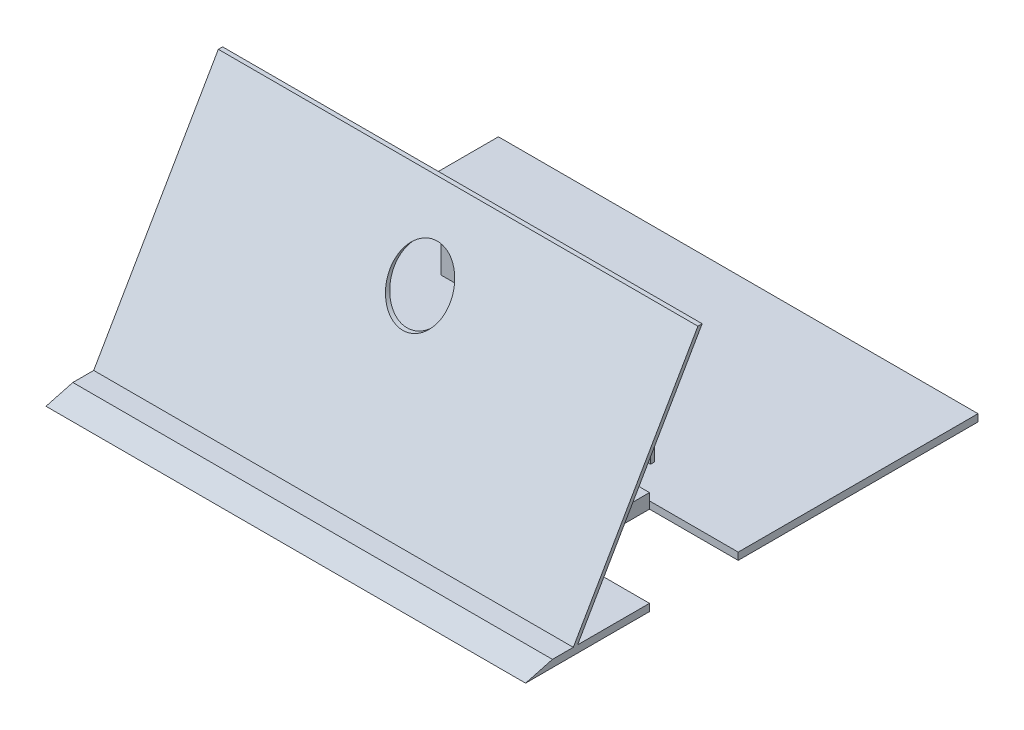
ISO-10303-21;
HEADER;
FILE_DESCRIPTION(('STEP AP214'),'2;1');
FILE_NAME('part.step','',(''),(''),'','','');
FILE_SCHEMA(('AUTOMOTIVE_DESIGN { 1 0 10303 214 1 1 1 1 }'));
ENDSEC;
DATA;
#1=APPLICATION_CONTEXT('core data for automotive mechanical design processes');
#2=APPLICATION_PROTOCOL_DEFINITION('international standard','automotive_design',2000,#1);
#3=PRODUCT_CONTEXT('',#1,'mechanical');
#4=PRODUCT('Part','Part','',(#3));
#5=PRODUCT_RELATED_PRODUCT_CATEGORY('part','',(#4));
#6=PRODUCT_DEFINITION_FORMATION('','',#4);
#7=PRODUCT_DEFINITION_CONTEXT('part definition',#1,'design');
#8=PRODUCT_DEFINITION('design','',#6,#7);
#9=PRODUCT_DEFINITION_SHAPE('','',#8);
#10=(LENGTH_UNIT() NAMED_UNIT(*) SI_UNIT(.MILLI.,.METRE.));
#11=(NAMED_UNIT(*) PLANE_ANGLE_UNIT() SI_UNIT($,.RADIAN.));
#12=(NAMED_UNIT(*) SI_UNIT($,.STERADIAN.) SOLID_ANGLE_UNIT());
#13=UNCERTAINTY_MEASURE_WITH_UNIT(LENGTH_MEASURE(1.E-05),#10,'distance_accuracy_value','');
#14=(GEOMETRIC_REPRESENTATION_CONTEXT(3) GLOBAL_UNCERTAINTY_ASSIGNED_CONTEXT((#13)) GLOBAL_UNIT_ASSIGNED_CONTEXT((#10,
#11,#12)) REPRESENTATION_CONTEXT('',''));
#15=CARTESIAN_POINT('',(0.,0.,0.));
#16=DIRECTION('',(0.,0.,1.));
#17=DIRECTION('',(1.,0.,0.));
#18=AXIS2_PLACEMENT_3D('',#15,#16,#17);
#19=CARTESIAN_POINT('',(50.,52.54,88.6741950797057));
#20=DIRECTION('',(0.,-1.,0.));
#21=DIRECTION('',(0.,0.,-1.));
#22=AXIS2_PLACEMENT_3D('',#19,#20,#21);
#23=PLANE('',#22);
#24=DIRECTION('',(0.,0.,-1.));
#25=VECTOR('',#24,1.);
#26=CARTESIAN_POINT('',(-49.9693576976457,52.54,88.6741950797057));
#27=LINE('',#26,#25);
#28=CARTESIAN_POINT('',(-49.9693576976457,52.54,38.3958714922409));
#29=VERTEX_POINT('',#28);
#30=CARTESIAN_POINT('',(-49.9693576976457,52.5399999999999,35.));
#31=VERTEX_POINT('',#30);
#32=EDGE_CURVE('E338',#29,#31,#27,.T.);
#33=ORIENTED_EDGE('',*,*,#32,.F.);
#34=DIRECTION('',(1.,0.,0.));
#35=VECTOR('',#34,1.);
#36=CARTESIAN_POINT('',(50.,52.54,38.3958714922409));
#37=LINE('',#36,#35);
#38=CARTESIAN_POINT('',(50.,52.54,38.3958714922409));
#39=VERTEX_POINT('',#38);
#40=EDGE_CURVE('E351',#29,#39,#37,.T.);
#41=ORIENTED_EDGE('',*,*,#40,.T.);
#42=DIRECTION('',(0.,0.,-1.));
#43=VECTOR('',#42,1.);
#44=CARTESIAN_POINT('',(50.,52.54,88.6741950797057));
#45=LINE('',#44,#43);
#46=CARTESIAN_POINT('',(50.,52.54,-15.));
#47=VERTEX_POINT('',#46);
#48=EDGE_CURVE('E342',#39,#47,#45,.T.);
#49=ORIENTED_EDGE('',*,*,#48,.T.);
#50=DIRECTION('',(-1.,0.,0.));
#51=VECTOR('',#50,1.);
#52=CARTESIAN_POINT('',(50.,52.54,-15.));
#53=LINE('',#52,#51);
#54=CARTESIAN_POINT('',(-50.,52.5399999999999,-15.));
#55=VERTEX_POINT('',#54);
#56=EDGE_CURVE('E303',#47,#55,#53,.T.);
#57=ORIENTED_EDGE('',*,*,#56,.T.);
#58=DIRECTION('',(0.,0.,1.));
#59=VECTOR('',#58,1.);
#60=CARTESIAN_POINT('',(-50.,52.5399999999999,-15.));
#61=LINE('',#60,#59);
#62=CARTESIAN_POINT('',(-50.,52.5399999999999,35.));
#63=VERTEX_POINT('',#62);
#64=EDGE_CURVE('E311',#55,#63,#61,.T.);
#65=ORIENTED_EDGE('',*,*,#64,.T.);
#66=DIRECTION('',(-1.,0.,0.));
#67=VECTOR('',#66,1.);
#68=CARTESIAN_POINT('',(50.,52.54,35.));
#69=LINE('',#68,#67);
#70=EDGE_CURVE('E280',#31,#63,#69,.T.);
#71=ORIENTED_EDGE('',*,*,#70,.F.);
#72=EDGE_LOOP('',(#33,#41,#49,#57,#65,#71));
#73=FACE_BOUND('',#72,.T.);
#74=DIRECTION('',(0.,0.,1.));
#75=VECTOR('',#74,1.);
#76=CARTESIAN_POINT('',(-12.5,52.54,10.));
#77=LINE('',#76,#75);
#78=CARTESIAN_POINT('',(-12.5,52.54,10.));
#79=VERTEX_POINT('',#78);
#80=CARTESIAN_POINT('',(-12.5,52.54,11.45));
#81=VERTEX_POINT('',#80);
#82=EDGE_CURVE('E264',#79,#81,#77,.T.);
#83=ORIENTED_EDGE('',*,*,#82,.F.);
#84=DIRECTION('',(-1.,0.,0.));
#85=VECTOR('',#84,1.);
#86=CARTESIAN_POINT('',(-12.5,52.54,10.));
#87=LINE('',#86,#85);
#88=CARTESIAN_POINT('',(12.5,52.54,10.));
#89=VERTEX_POINT('',#88);
#90=EDGE_CURVE('E261',#89,#79,#87,.T.);
#91=ORIENTED_EDGE('',*,*,#90,.F.);
#92=DIRECTION('',(0.,0.,-1.));
#93=VECTOR('',#92,1.);
#94=CARTESIAN_POINT('',(12.5,52.54,10.));
#95=LINE('',#94,#93);
#96=CARTESIAN_POINT('',(12.5,52.54,11.45));
#97=VERTEX_POINT('',#96);
#98=EDGE_CURVE('E65',#97,#89,#95,.T.);
#99=ORIENTED_EDGE('',*,*,#98,.F.);
#100=DIRECTION('',(1.,0.,0.));
#101=VECTOR('',#100,1.);
#102=CARTESIAN_POINT('',(-12.5,52.54,11.45));
#103=LINE('',#102,#101);
#104=EDGE_CURVE('E60',#81,#97,#103,.T.);
#105=ORIENTED_EDGE('',*,*,#104,.F.);
#106=EDGE_LOOP('',(#83,#91,#99,#105));
#107=FACE_BOUND('',#106,.T.);
#108=ADVANCED_FACE('F43',(#73,#107),#23,.F.);
#109=CARTESIAN_POINT('',(100.,2.99999999999999,0.));
#110=DIRECTION('',(0.,-1.,0.));
#111=DIRECTION('',(0.,0.,-1.));
#112=AXIS2_PLACEMENT_3D('',#109,#110,#111);
#113=PLANE('',#112);
#114=DIRECTION('',(-1.,0.,0.));
#115=VECTOR('',#114,1.);
#116=CARTESIAN_POINT('',(63.,2.99999999999999,0.));
#117=LINE('',#116,#115);
#118=CARTESIAN_POINT('',(63.,2.99999999999999,0.));
#119=VERTEX_POINT('',#118);
#120=CARTESIAN_POINT('',(-63.669935473827,2.99999999999999,0.));
#121=VERTEX_POINT('',#120);
#122=EDGE_CURVE('E358',#119,#121,#117,.T.);
#123=ORIENTED_EDGE('',*,*,#122,.F.);
#124=DIRECTION('',(-1.,0.,0.));
#125=VECTOR('',#124,1.);
#126=CARTESIAN_POINT('',(100.,2.99999999999999,0.));
#127=LINE('',#126,#125);
#128=CARTESIAN_POINT('',(100.,2.99999999999999,0.));
#129=VERTEX_POINT('',#128);
#130=EDGE_CURVE('E406',#129,#119,#127,.T.);
#131=ORIENTED_EDGE('',*,*,#130,.F.);
#132=DIRECTION('',(0.,0.,1.));
#133=VECTOR('',#132,1.);
#134=CARTESIAN_POINT('',(100.,2.99999999999999,0.));
#135=LINE('',#134,#133);
#136=CARTESIAN_POINT('',(100.,3.,-100.));
#137=VERTEX_POINT('',#136);
#138=EDGE_CURVE('E495',#137,#129,#135,.T.);
#139=ORIENTED_EDGE('',*,*,#138,.F.);
#140=DIRECTION('',(-1.,0.,0.));
#141=VECTOR('',#140,1.);
#142=CARTESIAN_POINT('',(100.,3.,-100.));
#143=LINE('',#142,#141);
#144=CARTESIAN_POINT('',(-100.,3.,-100.));
#145=VERTEX_POINT('',#144);
#146=EDGE_CURVE('E536',#137,#145,#143,.T.);
#147=ORIENTED_EDGE('',*,*,#146,.T.);
#148=DIRECTION('',(0.,0.,1.));
#149=VECTOR('',#148,1.);
#150=CARTESIAN_POINT('',(-100.,2.99999999999999,0.));
#151=LINE('',#150,#149);
#152=CARTESIAN_POINT('',(-100.,2.99999999999999,0.));
#153=VERTEX_POINT('',#152);
#154=EDGE_CURVE('E513',#145,#153,#151,.T.);
#155=ORIENTED_EDGE('',*,*,#154,.T.);
#156=DIRECTION('',(-1.,0.,0.));
#157=VECTOR('',#156,1.);
#158=CARTESIAN_POINT('',(-100.669935473827,2.99999999999999,0.));
#159=LINE('',#158,#157);
#160=EDGE_CURVE('E433',#121,#153,#159,.T.);
#161=ORIENTED_EDGE('',*,*,#160,.F.);
#162=EDGE_LOOP('',(#123,#131,#139,#147,#155,#161));
#163=FACE_BOUND('',#162,.T.);
#164=DIRECTION('',(0.,0.,1.));
#165=VECTOR('',#164,1.);
#166=CARTESIAN_POINT('',(50.,2.99999999999999,-15.));
#167=LINE('',#166,#165);
#168=CARTESIAN_POINT('',(50.,2.99999999999999,-15.));
#169=VERTEX_POINT('',#168);
#170=CARTESIAN_POINT('',(50.,2.99999999999999,-13.46));
#171=VERTEX_POINT('',#170);
#172=EDGE_CURVE('E270',#169,#171,#167,.T.);
#173=ORIENTED_EDGE('',*,*,#172,.T.);
#174=DIRECTION('',(-1.,0.,0.));
#175=VECTOR('',#174,1.);
#176=CARTESIAN_POINT('',(-50.,2.99999999999999,-13.46));
#177=LINE('',#176,#175);
#178=CARTESIAN_POINT('',(-50.,2.99999999999999,-13.46));
#179=VERTEX_POINT('',#178);
#180=EDGE_CURVE('E266',#171,#179,#177,.T.);
#181=ORIENTED_EDGE('',*,*,#180,.T.);
#182=DIRECTION('',(0.,0.,-1.));
#183=VECTOR('',#182,1.);
#184=CARTESIAN_POINT('',(-50.,2.99999999999999,-15.));
#185=LINE('',#184,#183);
#186=CARTESIAN_POINT('',(-50.,2.99999999999999,-15.));
#187=VERTEX_POINT('',#186);
#188=EDGE_CURVE('E286',#179,#187,#185,.T.);
#189=ORIENTED_EDGE('',*,*,#188,.T.);
#190=DIRECTION('',(1.,0.,0.));
#191=VECTOR('',#190,1.);
#192=CARTESIAN_POINT('',(-50.,2.99999999999999,-15.));
#193=LINE('',#192,#191);
#194=EDGE_CURVE('E293',#187,#169,#193,.T.);
#195=ORIENTED_EDGE('',*,*,#194,.T.);
#196=EDGE_LOOP('',(#173,#181,#189,#195));
#197=FACE_BOUND('',#196,.T.);
#198=ADVANCED_FACE('F587',(#163,#197),#113,.F.);
#199=CARTESIAN_POINT('',(50.,51.,88.6741950797057));
#200=DIRECTION('',(0.,1.,0.));
#201=DIRECTION('',(0.,0.,1.));
#202=AXIS2_PLACEMENT_3D('',#199,#200,#201);
#203=PLANE('',#202);
#204=DIRECTION('',(-1.,0.,0.));
#205=VECTOR('',#204,1.);
#206=CARTESIAN_POINT('',(-50.,51.,-13.46));
#207=LINE('',#206,#205);
#208=CARTESIAN_POINT('',(50.,51.,-13.46));
#209=VERTEX_POINT('',#208);
#210=CARTESIAN_POINT('',(-50.,51.,-13.46));
#211=VERTEX_POINT('',#210);
#212=EDGE_CURVE('E276',#209,#211,#207,.T.);
#213=ORIENTED_EDGE('',*,*,#212,.F.);
#214=DIRECTION('',(0.,0.,-1.));
#215=VECTOR('',#214,1.);
#216=CARTESIAN_POINT('',(50.,51.,88.6741950797057));
#217=LINE('',#216,#215);
#218=CARTESIAN_POINT('',(50.,51.,39.284990906793));
#219=VERTEX_POINT('',#218);
#220=EDGE_CURVE('E330',#219,#209,#217,.T.);
#221=ORIENTED_EDGE('',*,*,#220,.F.);
#222=DIRECTION('',(-1.,0.,0.));
#223=VECTOR('',#222,1.);
#224=CARTESIAN_POINT('',(50.,51.,39.284990906793));
#225=LINE('',#224,#223);
#226=CARTESIAN_POINT('',(-49.9693576976457,51.,39.284990906793));
#227=VERTEX_POINT('',#226);
#228=EDGE_CURVE('E345',#219,#227,#225,.T.);
#229=ORIENTED_EDGE('',*,*,#228,.T.);
#230=DIRECTION('',(0.,0.,-1.));
#231=VECTOR('',#230,1.);
#232=CARTESIAN_POINT('',(-49.9693576976457,51.,88.6741950797057));
#233=LINE('',#232,#231);
#234=CARTESIAN_POINT('',(-49.9693576976457,51.,35.));
#235=VERTEX_POINT('',#234);
#236=EDGE_CURVE('E334',#227,#235,#233,.T.);
#237=ORIENTED_EDGE('',*,*,#236,.T.);
#238=DIRECTION('',(1.,0.,0.));
#239=VECTOR('',#238,1.);
#240=CARTESIAN_POINT('',(50.,51.,35.));
#241=LINE('',#240,#239);
#242=CARTESIAN_POINT('',(-50.,51.,35.));
#243=VERTEX_POINT('',#242);
#244=EDGE_CURVE('E304',#243,#235,#241,.T.);
#245=ORIENTED_EDGE('',*,*,#244,.F.);
#246=DIRECTION('',(0.,0.,1.));
#247=VECTOR('',#246,1.);
#248=CARTESIAN_POINT('',(-50.,51.,-15.));
#249=LINE('',#248,#247);
#250=EDGE_CURVE('E320',#211,#243,#249,.T.);
#251=ORIENTED_EDGE('',*,*,#250,.F.);
#252=EDGE_LOOP('',(#213,#221,#229,#237,#245,#251));
#253=FACE_BOUND('',#252,.T.);
#254=ADVANCED_FACE('F597',(#253),#203,.F.);
#255=CARTESIAN_POINT('',(-100.,93.,15.0362796008288));
#256=DIRECTION('',(0.,-0.499999999999998,-0.86602540378444));
#257=DIRECTION('',(0.,0.86602540378444,-0.499999999999998));
#258=AXIS2_PLACEMENT_3D('',#255,#256,#257);
#259=PLANE('',#258);
#260=CARTESIAN_POINT('',(0.,65.54,30.8903179927758));
#261=DIRECTION('',(0.,-0.499999999999998,-0.86602540378444));
#262=DIRECTION('',(0.,-0.86602540378444,0.499999999999998));
#263=AXIS2_PLACEMENT_3D('',#260,#261,#262);
#264=ELLIPSE('',#263,14.4337567297406,12.5);
#265=CARTESIAN_POINT('',(0.,53.04,38.1071963576461));
#266=VERTEX_POINT('',#265);
#267=EDGE_CURVE('E969',#266,#266,#264,.T.);
#268=ORIENTED_EDGE('',*,*,#267,.F.);
#269=EDGE_LOOP('',(#268));
#270=FACE_BOUND('',#269,.T.);
#271=DIRECTION('',(0.,0.86602540378444,-0.499999999999998));
#272=VECTOR('',#271,1.);
#273=CARTESIAN_POINT('',(100.,93.,15.0362796008288));
#274=LINE('',#273,#272);
#275=CARTESIAN_POINT('',(100.,2.99999999999998,66.9978038278948));
#276=VERTEX_POINT('',#275);
#277=CARTESIAN_POINT('',(100.,93.,15.0362796008288));
#278=VERTEX_POINT('',#277);
#279=EDGE_CURVE('E417',#276,#278,#274,.T.);
#280=ORIENTED_EDGE('',*,*,#279,.F.);
#281=DIRECTION('',(1.,0.,0.));
#282=VECTOR('',#281,1.);
#283=CARTESIAN_POINT('',(-100.,3.,66.9978038278948));
#284=LINE('',#283,#282);
#285=CARTESIAN_POINT('',(-100.,3.,66.9978038278948));
#286=VERTEX_POINT('',#285);
#287=EDGE_CURVE('E465',#286,#276,#284,.T.);
#288=ORIENTED_EDGE('',*,*,#287,.F.);
#289=DIRECTION('',(0.,0.86602540378444,-0.499999999999998));
#290=VECTOR('',#289,1.);
#291=CARTESIAN_POINT('',(-100.,93.,15.0362796008288));
#292=LINE('',#291,#290);
#293=CARTESIAN_POINT('',(-100.,93.,15.0362796008288));
#294=VERTEX_POINT('',#293);
#295=EDGE_CURVE('E453',#286,#294,#292,.T.);
#296=ORIENTED_EDGE('',*,*,#295,.T.);
#297=DIRECTION('',(1.,0.,0.));
#298=VECTOR('',#297,1.);
#299=CARTESIAN_POINT('',(-100.,93.,15.0362796008288));
#300=LINE('',#299,#298);
#301=EDGE_CURVE('E483',#294,#278,#300,.T.);
#302=ORIENTED_EDGE('',*,*,#301,.T.);
#303=EDGE_LOOP('',(#280,#288,#296,#302));
#304=FACE_BOUND('',#303,.T.);
#305=DIRECTION('',(0.,-0.86602540378444,0.499999999999998));
#306=VECTOR('',#305,1.);
#307=CARTESIAN_POINT('',(50.,30.7688472567806,50.965452389107));
#308=LINE('',#307,#306);
#309=EDGE_CURVE('E354',#39,#219,#308,.T.);
#310=ORIENTED_EDGE('',*,*,#309,.F.);
#311=ORIENTED_EDGE('',*,*,#40,.F.);
#312=DIRECTION('',(0.,0.86602540378444,-0.499999999999998));
#313=VECTOR('',#312,1.);
#314=CARTESIAN_POINT('',(-49.9693576976457,30.7688472567806,50.965452389107));
#315=LINE('',#314,#313);
#316=EDGE_CURVE('E348',#227,#29,#315,.T.);
#317=ORIENTED_EDGE('',*,*,#316,.F.);
#318=ORIENTED_EDGE('',*,*,#228,.F.);
#319=EDGE_LOOP('',(#310,#311,#317,#318));
#320=FACE_BOUND('',#319,.T.);
#321=ADVANCED_FACE('F572',(#270,#304,#320),#259,.T.);
#322=DIRECTION('',(1.,0.,0.));
#323=VECTOR('',#322,1.);
#324=CARTESIAN_POINT('',(63.,2.99999999999998,37.));
#325=LINE('',#324,#323);
#326=CARTESIAN_POINT('',(-63.669935473827,2.99999999999998,37.));
#327=VERTEX_POINT('',#326);
#328=CARTESIAN_POINT('',(63.,2.99999999999998,37.));
#329=VERTEX_POINT('',#328);
#330=EDGE_CURVE('E364',#327,#329,#325,.T.);
#331=ORIENTED_EDGE('',*,*,#330,.F.);
#332=DIRECTION('',(1.,0.,0.));
#333=VECTOR('',#332,1.);
#334=CARTESIAN_POINT('',(-100.669935473827,2.99999999999998,37.));
#335=LINE('',#334,#333);
#336=CARTESIAN_POINT('',(-100.,2.99999999999998,37.));
#337=VERTEX_POINT('',#336);
#338=EDGE_CURVE('E391',#337,#327,#335,.T.);
#339=ORIENTED_EDGE('',*,*,#338,.F.);
#340=EDGE_CURVE('E518',#337,#286,#151,.T.);
#341=ORIENTED_EDGE('',*,*,#340,.T.);
#342=ORIENTED_EDGE('',*,*,#287,.T.);
#343=CARTESIAN_POINT('',(100.,2.99999999999998,37.));
#344=VERTEX_POINT('',#343);
#345=EDGE_CURVE('E500',#344,#276,#135,.T.);
#346=ORIENTED_EDGE('',*,*,#345,.F.);
#347=DIRECTION('',(1.,0.,0.));
#348=VECTOR('',#347,1.);
#349=CARTESIAN_POINT('',(100.,2.99999999999998,37.));
#350=LINE('',#349,#348);
#351=EDGE_CURVE('E397',#329,#344,#350,.T.);
#352=ORIENTED_EDGE('',*,*,#351,.F.);
#353=EDGE_LOOP('',(#331,#339,#341,#342,#346,#352));
#354=FACE_BOUND('',#353,.T.);
#355=ADVANCED_FACE('F568',(#354),#113,.F.);
#356=CARTESIAN_POINT('',(100.,0.,0.));
#357=DIRECTION('',(1.,0.,0.));
#358=DIRECTION('',(0.,0.,-1.));
#359=AXIS2_PLACEMENT_3D('',#356,#357,#358);
#360=PLANE('',#359);
#361=DIRECTION('',(0.,1.,0.));
#362=VECTOR('',#361,1.);
#363=CARTESIAN_POINT('',(100.,0.,37.));
#364=LINE('',#363,#362);
#365=CARTESIAN_POINT('',(100.,0.,37.));
#366=VERTEX_POINT('',#365);
#367=EDGE_CURVE('E413',#366,#344,#364,.T.);
#368=ORIENTED_EDGE('',*,*,#367,.T.);
#369=ORIENTED_EDGE('',*,*,#345,.T.);
#370=ORIENTED_EDGE('',*,*,#279,.T.);
#371=DIRECTION('',(0.,0.,1.));
#372=VECTOR('',#371,1.);
#373=CARTESIAN_POINT('',(100.,93.,16.8145184299328));
#374=LINE('',#373,#372);
#375=CARTESIAN_POINT('',(100.,93.,16.8145184299328));
#376=VERTEX_POINT('',#375);
#377=EDGE_CURVE('E469',#278,#376,#374,.T.);
#378=ORIENTED_EDGE('',*,*,#377,.T.);
#379=DIRECTION('',(0.,-0.86602540378444,0.499999999999998));
#380=VECTOR('',#379,1.);
#381=CARTESIAN_POINT('',(100.,3.,68.7760426569988));
#382=LINE('',#381,#380);
#383=CARTESIAN_POINT('',(100.,3.,68.7760426569988));
#384=VERTEX_POINT('',#383);
#385=EDGE_CURVE('E458',#376,#384,#382,.T.);
#386=ORIENTED_EDGE('',*,*,#385,.T.);
#387=CARTESIAN_POINT('',(100.,2.99999999999998,77.4760426569988));
#388=VERTEX_POINT('',#387);
#389=EDGE_CURVE('E493',#384,#388,#135,.T.);
#390=ORIENTED_EDGE('',*,*,#389,.T.);
#391=DIRECTION('',(0.,-0.258819045102515,0.96592582628907));
#392=VECTOR('',#391,1.);
#393=CARTESIAN_POINT('',(100.,22.1680487699259,5.93991076567525));
#394=LINE('',#393,#392);
#395=CARTESIAN_POINT('',(100.,0.,88.6721950797057));
#396=VERTEX_POINT('',#395);
#397=EDGE_CURVE('E499',#388,#396,#394,.T.);
#398=ORIENTED_EDGE('',*,*,#397,.T.);
#399=DIRECTION('',(0.,0.,-1.));
#400=VECTOR('',#399,1.);
#401=CARTESIAN_POINT('',(100.,0.,0.));
#402=LINE('',#401,#400);
#403=EDGE_CURVE('E504',#396,#366,#402,.T.);
#404=ORIENTED_EDGE('',*,*,#403,.T.);
#405=EDGE_LOOP('',(#368,#369,#370,#378,#386,#390,#398,#404));
#406=FACE_BOUND('',#405,.T.);
#407=ADVANCED_FACE('F579',(#406),#360,.T.);
#408=CARTESIAN_POINT('',(-100.,0.,0.));
#409=DIRECTION('',(1.,0.,0.));
#410=DIRECTION('',(0.,0.,-1.));
#411=AXIS2_PLACEMENT_3D('',#408,#409,#410);
#412=PLANE('',#411);
#413=DIRECTION('',(0.,0.,-1.));
#414=VECTOR('',#413,1.);
#415=CARTESIAN_POINT('',(-100.,0.,0.));
#416=LINE('',#415,#414);
#417=CARTESIAN_POINT('',(-100.,0.,0.));
#418=VERTEX_POINT('',#417);
#419=CARTESIAN_POINT('',(-100.,0.,-100.));
#420=VERTEX_POINT('',#419);
#421=EDGE_CURVE('E521',#418,#420,#416,.T.);
#422=ORIENTED_EDGE('',*,*,#421,.F.);
#423=DIRECTION('',(0.,1.,0.));
#424=VECTOR('',#423,1.);
#425=CARTESIAN_POINT('',(-100.,0.,0.));
#426=LINE('',#425,#424);
#427=EDGE_CURVE('E11',#418,#153,#426,.T.);
#428=ORIENTED_EDGE('',*,*,#427,.T.);
#429=ORIENTED_EDGE('',*,*,#154,.F.);
#430=DIRECTION('',(0.,1.,0.));
#431=VECTOR('',#430,1.);
#432=CARTESIAN_POINT('',(-100.,0.,-100.));
#433=LINE('',#432,#431);
#434=EDGE_CURVE('E479',#420,#145,#433,.T.);
#435=ORIENTED_EDGE('',*,*,#434,.F.);
#436=EDGE_LOOP('',(#422,#428,#429,#435));
#437=FACE_BOUND('',#436,.T.);
#438=ADVANCED_FACE('F586',(#437),#412,.F.);
#439=DIRECTION('',(1.,0.,0.));
#440=VECTOR('',#439,1.);
#441=CARTESIAN_POINT('',(-100.,3.,68.7760426569988));
#442=LINE('',#441,#440);
#443=CARTESIAN_POINT('',(-100.,3.,68.7760426569988));
#444=VERTEX_POINT('',#443);
#445=EDGE_CURVE('E476',#444,#384,#442,.T.);
#446=ORIENTED_EDGE('',*,*,#445,.F.);
#447=CARTESIAN_POINT('',(-100.,2.99999999999998,77.4760426569988));
#448=VERTEX_POINT('',#447);
#449=EDGE_CURVE('E512',#444,#448,#151,.T.);
#450=ORIENTED_EDGE('',*,*,#449,.T.);
#451=DIRECTION('',(-1.,0.,0.));
#452=VECTOR('',#451,1.);
#453=CARTESIAN_POINT('',(100.,2.99999999999998,77.4760426569988));
#454=LINE('',#453,#452);
#455=EDGE_CURVE('E532',#388,#448,#454,.T.);
#456=ORIENTED_EDGE('',*,*,#455,.F.);
#457=ORIENTED_EDGE('',*,*,#389,.F.);
#458=EDGE_LOOP('',(#446,#450,#456,#457));
#459=FACE_BOUND('',#458,.T.);
#460=ADVANCED_FACE('F584',(#459),#113,.F.);
#461=CARTESIAN_POINT('',(100.,0.,-100.));
#462=DIRECTION('',(0.,0.,1.));
#463=DIRECTION('',(1.,0.,0.));
#464=AXIS2_PLACEMENT_3D('',#461,#462,#463);
#465=PLANE('',#464);
#466=ORIENTED_EDGE('',*,*,#434,.T.);
#467=ORIENTED_EDGE('',*,*,#146,.F.);
#468=DIRECTION('',(0.,1.,0.));
#469=VECTOR('',#468,1.);
#470=CARTESIAN_POINT('',(100.,0.,-100.));
#471=LINE('',#470,#469);
#472=CARTESIAN_POINT('',(100.,0.,-100.));
#473=VERTEX_POINT('',#472);
#474=EDGE_CURVE('E489',#473,#137,#471,.T.);
#475=ORIENTED_EDGE('',*,*,#474,.F.);
#476=DIRECTION('',(-1.,0.,0.));
#477=VECTOR('',#476,1.);
#478=CARTESIAN_POINT('',(100.,0.,-100.));
#479=LINE('',#478,#477);
#480=EDGE_CURVE('E508',#473,#420,#479,.T.);
#481=ORIENTED_EDGE('',*,*,#480,.T.);
#482=EDGE_LOOP('',(#466,#467,#475,#481));
#483=FACE_BOUND('',#482,.T.);
#484=ADVANCED_FACE('F45',(#483),#465,.F.);
#485=CARTESIAN_POINT('',(100.,22.1680487699259,5.93991076567525));
#486=DIRECTION('',(0.,-0.96592582628907,-0.258819045102515));
#487=DIRECTION('',(0.,0.258819045102515,-0.96592582628907));
#488=AXIS2_PLACEMENT_3D('',#485,#486,#487);
#489=PLANE('',#488);
#490=DIRECTION('',(0.,-0.258819045102515,0.96592582628907));
#491=VECTOR('',#490,1.);
#492=CARTESIAN_POINT('',(-100.,22.1680487699259,5.93991076567525));
#493=LINE('',#492,#491);
#494=CARTESIAN_POINT('',(-100.,0.,88.6721950797057));
#495=VERTEX_POINT('',#494);
#496=EDGE_CURVE('E517',#448,#495,#493,.T.);
#497=ORIENTED_EDGE('',*,*,#496,.T.);
#498=DIRECTION('',(-1.,0.,0.));
#499=VECTOR('',#498,1.);
#500=CARTESIAN_POINT('',(100.,0.,88.6721950797057));
#501=LINE('',#500,#499);
#502=EDGE_CURVE('E528',#396,#495,#501,.T.);
#503=ORIENTED_EDGE('',*,*,#502,.F.);
#504=ORIENTED_EDGE('',*,*,#397,.F.);
#505=ORIENTED_EDGE('',*,*,#455,.T.);
#506=EDGE_LOOP('',(#497,#503,#504,#505));
#507=FACE_BOUND('',#506,.T.);
#508=ADVANCED_FACE('F556',(#507),#489,.F.);
#509=CARTESIAN_POINT('',(100.,0.,0.));
#510=DIRECTION('',(0.,1.,0.));
#511=DIRECTION('',(0.,0.,1.));
#512=AXIS2_PLACEMENT_3D('',#509,#510,#511);
#513=PLANE('',#512);
#514=DIRECTION('',(0.,0.,1.));
#515=VECTOR('',#514,1.);
#516=CARTESIAN_POINT('',(63.,0.,37.));
#517=LINE('',#516,#515);
#518=CARTESIAN_POINT('',(63.,0.,0.));
#519=VERTEX_POINT('',#518);
#520=CARTESIAN_POINT('',(63.,0.,37.));
#521=VERTEX_POINT('',#520);
#522=EDGE_CURVE('E396',#519,#521,#517,.T.);
#523=ORIENTED_EDGE('',*,*,#522,.T.);
#524=DIRECTION('',(1.,0.,0.));
#525=VECTOR('',#524,1.);
#526=CARTESIAN_POINT('',(100.,0.,37.));
#527=LINE('',#526,#525);
#528=EDGE_CURVE('E401',#521,#366,#527,.T.);
#529=ORIENTED_EDGE('',*,*,#528,.T.);
#530=ORIENTED_EDGE('',*,*,#403,.F.);
#531=ORIENTED_EDGE('',*,*,#502,.T.);
#532=CARTESIAN_POINT('',(-100.,0.,37.));
#533=VERTEX_POINT('',#532);
#534=EDGE_CURVE('E494',#495,#533,#416,.T.);
#535=ORIENTED_EDGE('',*,*,#534,.T.);
#536=DIRECTION('',(1.,0.,0.));
#537=VECTOR('',#536,1.);
#538=CARTESIAN_POINT('',(-100.669935473827,0.,37.));
#539=LINE('',#538,#537);
#540=CARTESIAN_POINT('',(-63.669935473827,0.,37.));
#541=VERTEX_POINT('',#540);
#542=EDGE_CURVE('E428',#533,#541,#539,.T.);
#543=ORIENTED_EDGE('',*,*,#542,.T.);
#544=DIRECTION('',(0.,0.,-1.));
#545=VECTOR('',#544,1.);
#546=CARTESIAN_POINT('',(-63.669935473827,0.,37.));
#547=LINE('',#546,#545);
#548=CARTESIAN_POINT('',(-63.669935473827,0.,0.));
#549=VERTEX_POINT('',#548);
#550=EDGE_CURVE('E432',#541,#549,#547,.T.);
#551=ORIENTED_EDGE('',*,*,#550,.T.);
#552=DIRECTION('',(-1.,0.,0.));
#553=VECTOR('',#552,1.);
#554=CARTESIAN_POINT('',(-100.669935473827,0.,0.));
#555=LINE('',#554,#553);
#556=EDGE_CURVE('E437',#549,#418,#555,.T.);
#557=ORIENTED_EDGE('',*,*,#556,.T.);
#558=ORIENTED_EDGE('',*,*,#421,.T.);
#559=ORIENTED_EDGE('',*,*,#480,.F.);
#560=CARTESIAN_POINT('',(100.,0.,0.));
#561=VERTEX_POINT('',#560);
#562=EDGE_CURVE('E503',#561,#473,#402,.T.);
#563=ORIENTED_EDGE('',*,*,#562,.F.);
#564=DIRECTION('',(-1.,0.,0.));
#565=VECTOR('',#564,1.);
#566=CARTESIAN_POINT('',(100.,0.,0.));
#567=LINE('',#566,#565);
#568=EDGE_CURVE('E392',#561,#519,#567,.T.);
#569=ORIENTED_EDGE('',*,*,#568,.T.);
#570=EDGE_LOOP('',(#523,#529,#530,#531,#535,#543,#551,#557,#558,#559,#563,#569));
#571=FACE_BOUND('',#570,.T.);
#572=ADVANCED_FACE('F551',(#571),#513,.F.);
#573=DIRECTION('',(0.,1.,0.));
#574=VECTOR('',#573,1.);
#575=CARTESIAN_POINT('',(100.,0.,0.));
#576=LINE('',#575,#574);
#577=EDGE_CURVE('E405',#561,#129,#576,.T.);
#578=ORIENTED_EDGE('',*,*,#577,.F.);
#579=ORIENTED_EDGE('',*,*,#562,.T.);
#580=ORIENTED_EDGE('',*,*,#474,.T.);
#581=ORIENTED_EDGE('',*,*,#138,.T.);
#582=EDGE_LOOP('',(#578,#579,#580,#581));
#583=FACE_BOUND('',#582,.T.);
#584=ADVANCED_FACE('F665',(#583),#360,.T.);
#585=ORIENTED_EDGE('',*,*,#340,.F.);
#586=DIRECTION('',(0.,-1.,0.));
#587=VECTOR('',#586,1.);
#588=CARTESIAN_POINT('',(-100.,0.,37.));
#589=LINE('',#588,#587);
#590=EDGE_CURVE('E53',#337,#533,#589,.T.);
#591=ORIENTED_EDGE('',*,*,#590,.T.);
#592=ORIENTED_EDGE('',*,*,#534,.F.);
#593=ORIENTED_EDGE('',*,*,#496,.F.);
#594=ORIENTED_EDGE('',*,*,#449,.F.);
#595=DIRECTION('',(0.,-0.86602540378444,0.499999999999998));
#596=VECTOR('',#595,1.);
#597=CARTESIAN_POINT('',(-100.,3.,68.7760426569988));
#598=LINE('',#597,#596);
#599=CARTESIAN_POINT('',(-100.,93.,16.8145184299328));
#600=VERTEX_POINT('',#599);
#601=EDGE_CURVE('E462',#600,#444,#598,.T.);
#602=ORIENTED_EDGE('',*,*,#601,.F.);
#603=DIRECTION('',(0.,0.,1.));
#604=VECTOR('',#603,1.);
#605=CARTESIAN_POINT('',(-100.,93.,16.8145184299328));
#606=LINE('',#605,#604);
#607=EDGE_CURVE('E457',#294,#600,#606,.T.);
#608=ORIENTED_EDGE('',*,*,#607,.F.);
#609=ORIENTED_EDGE('',*,*,#295,.F.);
#610=EDGE_LOOP('',(#585,#591,#592,#593,#594,#602,#608,#609));
#611=FACE_BOUND('',#610,.T.);
#612=ADVANCED_FACE('F545',(#611),#412,.F.);
#613=CARTESIAN_POINT('',(-100.,3.,68.7760426569988));
#614=DIRECTION('',(0.,0.499999999999998,0.86602540378444));
#615=DIRECTION('',(0.,-0.86602540378444,0.499999999999998));
#616=AXIS2_PLACEMENT_3D('',#613,#614,#615);
#617=PLANE('',#616);
#618=CARTESIAN_POINT('',(0.,65.54,32.6685568218799));
#619=DIRECTION('',(0.,0.499999999999998,0.86602540378444));
#620=DIRECTION('',(0.,-0.86602540378444,0.499999999999998));
#621=AXIS2_PLACEMENT_3D('',#618,#619,#620);
#622=ELLIPSE('',#621,14.4337567297406,12.5);
#623=CARTESIAN_POINT('',(0.,53.04,39.8854351867502));
#624=VERTEX_POINT('',#623);
#625=EDGE_CURVE('E47',#624,#624,#622,.T.);
#626=ORIENTED_EDGE('',*,*,#625,.F.);
#627=EDGE_LOOP('',(#626));
#628=FACE_BOUND('',#627,.T.);
#629=ORIENTED_EDGE('',*,*,#385,.F.);
#630=DIRECTION('',(1.,0.,0.));
#631=VECTOR('',#630,1.);
#632=CARTESIAN_POINT('',(-100.,93.,16.8145184299328));
#633=LINE('',#632,#631);
#634=EDGE_CURVE('E480',#600,#376,#633,.T.);
#635=ORIENTED_EDGE('',*,*,#634,.F.);
#636=ORIENTED_EDGE('',*,*,#601,.T.);
#637=ORIENTED_EDGE('',*,*,#445,.T.);
#638=EDGE_LOOP('',(#629,#635,#636,#637));
#639=FACE_BOUND('',#638,.T.);
#640=ADVANCED_FACE('F656',(#628,#639),#617,.T.);
#641=CARTESIAN_POINT('',(-100.,93.,16.8145184299328));
#642=DIRECTION('',(0.,1.,0.));
#643=DIRECTION('',(0.,0.,1.));
#644=AXIS2_PLACEMENT_3D('',#641,#642,#643);
#645=PLANE('',#644);
#646=ORIENTED_EDGE('',*,*,#377,.F.);
#647=ORIENTED_EDGE('',*,*,#301,.F.);
#648=ORIENTED_EDGE('',*,*,#607,.T.);
#649=ORIENTED_EDGE('',*,*,#634,.T.);
#650=EDGE_LOOP('',(#646,#647,#648,#649));
#651=FACE_BOUND('',#650,.T.);
#652=ADVANCED_FACE('F576',(#651),#645,.T.);
#653=CARTESIAN_POINT('',(-100.669935473827,0.,0.));
#654=DIRECTION('',(0.,0.,-1.));
#655=DIRECTION('',(-1.,0.,0.));
#656=AXIS2_PLACEMENT_3D('',#653,#654,#655);
#657=PLANE('',#656);
#658=ORIENTED_EDGE('',*,*,#556,.F.);
#659=DIRECTION('',(0.,1.,0.));
#660=VECTOR('',#659,1.);
#661=CARTESIAN_POINT('',(-63.669935473827,0.,0.));
#662=LINE('',#661,#660);
#663=EDGE_CURVE('E410',#549,#121,#662,.T.);
#664=ORIENTED_EDGE('',*,*,#663,.T.);
#665=ORIENTED_EDGE('',*,*,#160,.T.);
#666=ORIENTED_EDGE('',*,*,#427,.F.);
#667=EDGE_LOOP('',(#658,#664,#665,#666));
#668=FACE_BOUND('',#667,.T.);
#669=ADVANCED_FACE('F646',(#668),#657,.F.);
#670=CARTESIAN_POINT('',(-100.669935473827,0.,37.));
#671=DIRECTION('',(0.,0.,1.));
#672=DIRECTION('',(1.,0.,0.));
#673=AXIS2_PLACEMENT_3D('',#670,#671,#672);
#674=PLANE('',#673);
#675=ORIENTED_EDGE('',*,*,#338,.T.);
#676=DIRECTION('',(0.,1.,0.));
#677=VECTOR('',#676,1.);
#678=CARTESIAN_POINT('',(-63.669935473827,0.,37.));
#679=LINE('',#678,#677);
#680=EDGE_CURVE('E441',#541,#327,#679,.T.);
#681=ORIENTED_EDGE('',*,*,#680,.F.);
#682=ORIENTED_EDGE('',*,*,#542,.F.);
#683=ORIENTED_EDGE('',*,*,#590,.F.);
#684=EDGE_LOOP('',(#675,#681,#682,#683));
#685=FACE_BOUND('',#684,.T.);
#686=ADVANCED_FACE('F649',(#685),#674,.F.);
#687=CARTESIAN_POINT('',(-63.669935473827,0.,37.));
#688=DIRECTION('',(1.,0.,0.));
#689=DIRECTION('',(0.,0.,-1.));
#690=AXIS2_PLACEMENT_3D('',#687,#688,#689);
#691=PLANE('',#690);
#692=ORIENTED_EDGE('',*,*,#680,.T.);
#693=DIRECTION('',(0.,-1.,0.));
#694=VECTOR('',#693,1.);
#695=CARTESIAN_POINT('',(-63.669935473827,5.99999999999998,37.));
#696=LINE('',#695,#694);
#697=CARTESIAN_POINT('',(-63.669935473827,5.99999999999998,37.));
#698=VERTEX_POINT('',#697);
#699=EDGE_CURVE('E381',#698,#327,#696,.T.);
#700=ORIENTED_EDGE('',*,*,#699,.F.);
#701=DIRECTION('',(0.,0.,1.));
#702=VECTOR('',#701,1.);
#703=CARTESIAN_POINT('',(-63.669935473827,5.99999999999998,37.));
#704=LINE('',#703,#702);
#705=CARTESIAN_POINT('',(-63.669935473827,5.99999999999999,0.));
#706=VERTEX_POINT('',#705);
#707=EDGE_CURVE('E367',#706,#698,#704,.T.);
#708=ORIENTED_EDGE('',*,*,#707,.F.);
#709=DIRECTION('',(0.,-1.,0.));
#710=VECTOR('',#709,1.);
#711=CARTESIAN_POINT('',(-63.669935473827,5.99999999999999,0.));
#712=LINE('',#711,#710);
#713=EDGE_CURVE('E384',#706,#121,#712,.T.);
#714=ORIENTED_EDGE('',*,*,#713,.T.);
#715=ORIENTED_EDGE('',*,*,#663,.F.);
#716=ORIENTED_EDGE('',*,*,#550,.F.);
#717=EDGE_LOOP('',(#692,#700,#708,#714,#715,#716));
#718=FACE_BOUND('',#717,.T.);
#719=ADVANCED_FACE('F638',(#718),#691,.F.);
#720=CARTESIAN_POINT('',(100.,0.,37.));
#721=DIRECTION('',(0.,0.,1.));
#722=DIRECTION('',(0.,-1.,0.));
#723=AXIS2_PLACEMENT_3D('',#720,#721,#722);
#724=PLANE('',#723);
#725=ORIENTED_EDGE('',*,*,#351,.T.);
#726=ORIENTED_EDGE('',*,*,#367,.F.);
#727=ORIENTED_EDGE('',*,*,#528,.F.);
#728=DIRECTION('',(0.,1.,0.));
#729=VECTOR('',#728,1.);
#730=CARTESIAN_POINT('',(63.,0.,37.));
#731=LINE('',#730,#729);
#732=EDGE_CURVE('E418',#521,#329,#731,.T.);
#733=ORIENTED_EDGE('',*,*,#732,.T.);
#734=EDGE_LOOP('',(#725,#726,#727,#733));
#735=FACE_BOUND('',#734,.T.);
#736=ADVANCED_FACE('F634',(#735),#724,.F.);
#737=CARTESIAN_POINT('',(63.,0.,37.));
#738=DIRECTION('',(-1.,0.,0.));
#739=DIRECTION('',(0.,0.,1.));
#740=AXIS2_PLACEMENT_3D('',#737,#738,#739);
#741=PLANE('',#740);
#742=DIRECTION('',(0.,1.,0.));
#743=VECTOR('',#742,1.);
#744=CARTESIAN_POINT('',(63.,0.,0.));
#745=LINE('',#744,#743);
#746=EDGE_CURVE('E422',#519,#119,#745,.T.);
#747=ORIENTED_EDGE('',*,*,#746,.T.);
#748=DIRECTION('',(0.,-1.,0.));
#749=VECTOR('',#748,1.);
#750=CARTESIAN_POINT('',(63.,5.99999999999999,0.));
#751=LINE('',#750,#749);
#752=CARTESIAN_POINT('',(63.,5.99999999999999,0.));
#753=VERTEX_POINT('',#752);
#754=EDGE_CURVE('E388',#753,#119,#751,.T.);
#755=ORIENTED_EDGE('',*,*,#754,.F.);
#756=DIRECTION('',(0.,0.,-1.));
#757=VECTOR('',#756,1.);
#758=CARTESIAN_POINT('',(63.,5.99999999999998,37.));
#759=LINE('',#758,#757);
#760=CARTESIAN_POINT('',(63.,5.99999999999998,37.));
#761=VERTEX_POINT('',#760);
#762=EDGE_CURVE('E359',#761,#753,#759,.T.);
#763=ORIENTED_EDGE('',*,*,#762,.F.);
#764=DIRECTION('',(0.,-1.,0.));
#765=VECTOR('',#764,1.);
#766=CARTESIAN_POINT('',(63.,5.99999999999998,37.));
#767=LINE('',#766,#765);
#768=EDGE_CURVE('E373',#761,#329,#767,.T.);
#769=ORIENTED_EDGE('',*,*,#768,.T.);
#770=ORIENTED_EDGE('',*,*,#732,.F.);
#771=ORIENTED_EDGE('',*,*,#522,.F.);
#772=EDGE_LOOP('',(#747,#755,#763,#769,#770,#771));
#773=FACE_BOUND('',#772,.T.);
#774=ADVANCED_FACE('F637',(#773),#741,.F.);
#775=CARTESIAN_POINT('',(100.,0.,0.));
#776=DIRECTION('',(0.,0.,-1.));
#777=DIRECTION('',(-1.,0.,0.));
#778=AXIS2_PLACEMENT_3D('',#775,#776,#777);
#779=PLANE('',#778);
#780=ORIENTED_EDGE('',*,*,#130,.T.);
#781=ORIENTED_EDGE('',*,*,#746,.F.);
#782=ORIENTED_EDGE('',*,*,#568,.F.);
#783=ORIENTED_EDGE('',*,*,#577,.T.);
#784=EDGE_LOOP('',(#780,#781,#782,#783));
#785=FACE_BOUND('',#784,.T.);
#786=ADVANCED_FACE('F632',(#785),#779,.F.);
#787=CARTESIAN_POINT('',(63.,5.99999999999999,0.));
#788=DIRECTION('',(0.,0.,1.));
#789=DIRECTION('',(1.,0.,0.));
#790=AXIS2_PLACEMENT_3D('',#787,#788,#789);
#791=PLANE('',#790);
#792=ORIENTED_EDGE('',*,*,#122,.T.);
#793=ORIENTED_EDGE('',*,*,#713,.F.);
#794=DIRECTION('',(-1.,0.,0.));
#795=VECTOR('',#794,1.);
#796=CARTESIAN_POINT('',(63.,5.99999999999999,0.));
#797=LINE('',#796,#795);
#798=EDGE_CURVE('E363',#753,#706,#797,.T.);
#799=ORIENTED_EDGE('',*,*,#798,.F.);
#800=ORIENTED_EDGE('',*,*,#754,.T.);
#801=EDGE_LOOP('',(#792,#793,#799,#800));
#802=FACE_BOUND('',#801,.T.);
#803=ADVANCED_FACE('F628',(#802),#791,.F.);
#804=CARTESIAN_POINT('',(63.,5.99999999999998,37.));
#805=DIRECTION('',(0.,0.,-1.));
#806=DIRECTION('',(0.,1.,0.));
#807=AXIS2_PLACEMENT_3D('',#804,#805,#806);
#808=PLANE('',#807);
#809=ORIENTED_EDGE('',*,*,#330,.T.);
#810=ORIENTED_EDGE('',*,*,#768,.F.);
#811=DIRECTION('',(1.,0.,0.));
#812=VECTOR('',#811,1.);
#813=CARTESIAN_POINT('',(63.,5.99999999999998,37.));
#814=LINE('',#813,#812);
#815=EDGE_CURVE('E370',#698,#761,#814,.T.);
#816=ORIENTED_EDGE('',*,*,#815,.F.);
#817=ORIENTED_EDGE('',*,*,#699,.T.);
#818=EDGE_LOOP('',(#809,#810,#816,#817));
#819=FACE_BOUND('',#818,.T.);
#820=ADVANCED_FACE('F624',(#819),#808,.F.);
#821=CARTESIAN_POINT('',(0.,5.99999999999999,0.));
#822=DIRECTION('',(0.,1.,0.));
#823=DIRECTION('',(0.,0.,1.));
#824=AXIS2_PLACEMENT_3D('',#821,#822,#823);
#825=PLANE('',#824);
#826=ORIENTED_EDGE('',*,*,#762,.T.);
#827=ORIENTED_EDGE('',*,*,#798,.T.);
#828=ORIENTED_EDGE('',*,*,#707,.T.);
#829=ORIENTED_EDGE('',*,*,#815,.T.);
#830=EDGE_LOOP('',(#826,#827,#828,#829));
#831=FACE_BOUND('',#830,.T.);
#832=ADVANCED_FACE('F614',(#831),#825,.T.);
#833=CARTESIAN_POINT('',(-49.9693576976457,52.54,88.6741950797057));
#834=DIRECTION('',(1.,0.,0.));
#835=DIRECTION('',(0.,0.,-1.));
#836=AXIS2_PLACEMENT_3D('',#833,#834,#835);
#837=PLANE('',#836);
#838=ORIENTED_EDGE('',*,*,#236,.F.);
#839=ORIENTED_EDGE('',*,*,#316,.T.);
#840=ORIENTED_EDGE('',*,*,#32,.T.);
#841=DIRECTION('',(0.,-1.,0.));
#842=VECTOR('',#841,1.);
#843=CARTESIAN_POINT('',(-49.9693576976457,52.54,35.));
#844=LINE('',#843,#842);
#845=EDGE_CURVE('E323',#31,#235,#844,.T.);
#846=ORIENTED_EDGE('',*,*,#845,.T.);
#847=EDGE_LOOP('',(#838,#839,#840,#846));
#848=FACE_BOUND('',#847,.T.);
#849=ADVANCED_FACE('F610',(#848),#837,.F.);
#850=CARTESIAN_POINT('',(50.,52.54,88.6741950797057));
#851=DIRECTION('',(-1.,0.,0.));
#852=DIRECTION('',(0.,0.,1.));
#853=AXIS2_PLACEMENT_3D('',#850,#851,#852);
#854=PLANE('',#853);
#855=ORIENTED_EDGE('',*,*,#48,.F.);
#856=ORIENTED_EDGE('',*,*,#309,.T.);
#857=ORIENTED_EDGE('',*,*,#220,.T.);
#858=DIRECTION('',(0.,1.,0.));
#859=VECTOR('',#858,1.);
#860=CARTESIAN_POINT('',(50.,-0.002000000000002,-13.46));
#861=LINE('',#860,#859);
#862=EDGE_CURVE('E282',#171,#209,#861,.T.);
#863=ORIENTED_EDGE('',*,*,#862,.F.);
#864=ORIENTED_EDGE('',*,*,#172,.F.);
#865=DIRECTION('',(0.,1.,0.));
#866=VECTOR('',#865,1.);
#867=CARTESIAN_POINT('',(50.,52.54,-15.));
#868=LINE('',#867,#866);
#869=EDGE_CURVE('E299',#169,#47,#868,.T.);
#870=ORIENTED_EDGE('',*,*,#869,.T.);
#871=EDGE_LOOP('',(#855,#856,#857,#863,#864,#870));
#872=FACE_BOUND('',#871,.T.);
#873=ADVANCED_FACE('F613',(#872),#854,.F.);
#874=CARTESIAN_POINT('',(-50.,52.5399999999999,-15.));
#875=DIRECTION('',(-1.,0.,0.));
#876=DIRECTION('',(0.,0.,1.));
#877=AXIS2_PLACEMENT_3D('',#874,#875,#876);
#878=PLANE('',#877);
#879=DIRECTION('',(0.,-1.,0.));
#880=VECTOR('',#879,1.);
#881=CARTESIAN_POINT('',(-50.,52.5399999999999,35.));
#882=LINE('',#881,#880);
#883=EDGE_CURVE('E314',#63,#243,#882,.T.);
#884=ORIENTED_EDGE('',*,*,#883,.F.);
#885=ORIENTED_EDGE('',*,*,#64,.F.);
#886=DIRECTION('',(0.,-1.,0.));
#887=VECTOR('',#886,1.);
#888=CARTESIAN_POINT('',(-50.,52.5399999999999,-15.));
#889=LINE('',#888,#887);
#890=EDGE_CURVE('E308',#55,#187,#889,.T.);
#891=ORIENTED_EDGE('',*,*,#890,.T.);
#892=ORIENTED_EDGE('',*,*,#188,.F.);
#893=DIRECTION('',(0.,1.,0.));
#894=VECTOR('',#893,1.);
#895=CARTESIAN_POINT('',(-50.,-0.002000000000002,-13.46));
#896=LINE('',#895,#894);
#897=EDGE_CURVE('E281',#179,#211,#896,.T.);
#898=ORIENTED_EDGE('',*,*,#897,.T.);
#899=ORIENTED_EDGE('',*,*,#250,.T.);
#900=EDGE_LOOP('',(#884,#885,#891,#892,#898,#899));
#901=FACE_BOUND('',#900,.T.);
#902=ADVANCED_FACE('F608',(#901),#878,.T.);
#903=CARTESIAN_POINT('',(0.,0.,-15.));
#904=DIRECTION('',(0.,0.,-1.));
#905=DIRECTION('',(-1.,0.,0.));
#906=AXIS2_PLACEMENT_3D('',#903,#904,#905);
#907=PLANE('',#906);
#908=ORIENTED_EDGE('',*,*,#869,.F.);
#909=ORIENTED_EDGE('',*,*,#194,.F.);
#910=ORIENTED_EDGE('',*,*,#890,.F.);
#911=ORIENTED_EDGE('',*,*,#56,.F.);
#912=EDGE_LOOP('',(#908,#909,#910,#911));
#913=FACE_BOUND('',#912,.T.);
#914=ADVANCED_FACE('F753',(#913),#907,.T.);
#915=CARTESIAN_POINT('',(0.,0.,35.));
#916=DIRECTION('',(0.,0.,-1.));
#917=DIRECTION('',(-1.,0.,0.));
#918=AXIS2_PLACEMENT_3D('',#915,#916,#917);
#919=PLANE('',#918);
#920=ORIENTED_EDGE('',*,*,#845,.F.);
#921=ORIENTED_EDGE('',*,*,#70,.T.);
#922=ORIENTED_EDGE('',*,*,#883,.T.);
#923=ORIENTED_EDGE('',*,*,#244,.T.);
#924=EDGE_LOOP('',(#920,#921,#922,#923));
#925=FACE_BOUND('',#924,.T.);
#926=ADVANCED_FACE('F760',(#925),#919,.F.);
#927=CARTESIAN_POINT('',(-50.,-0.002000000000002,-13.46));
#928=DIRECTION('',(0.,0.,-1.));
#929=DIRECTION('',(-1.,0.,0.));
#930=AXIS2_PLACEMENT_3D('',#927,#928,#929);
#931=PLANE('',#930);
#932=ORIENTED_EDGE('',*,*,#180,.F.);
#933=ORIENTED_EDGE('',*,*,#862,.T.);
#934=ORIENTED_EDGE('',*,*,#212,.T.);
#935=ORIENTED_EDGE('',*,*,#897,.F.);
#936=EDGE_LOOP('',(#932,#933,#934,#935));
#937=FACE_BOUND('',#936,.T.);
#938=ADVANCED_FACE('F768',(#937),#931,.F.);
#939=CARTESIAN_POINT('',(-12.5,77.54,10.));
#940=DIRECTION('',(1.,0.,0.));
#941=DIRECTION('',(0.,0.,-1.));
#942=AXIS2_PLACEMENT_3D('',#939,#940,#941);
#943=PLANE('',#942);
#944=ORIENTED_EDGE('',*,*,#82,.T.);
#945=DIRECTION('',(0.,-1.,0.));
#946=VECTOR('',#945,1.);
#947=CARTESIAN_POINT('',(-12.5,77.54,11.45));
#948=LINE('',#947,#946);
#949=CARTESIAN_POINT('',(-12.5,77.54,11.45));
#950=VERTEX_POINT('',#949);
#951=EDGE_CURVE('E243',#950,#81,#948,.T.);
#952=ORIENTED_EDGE('',*,*,#951,.F.);
#953=DIRECTION('',(0.,0.,1.));
#954=VECTOR('',#953,1.);
#955=CARTESIAN_POINT('',(-12.5,77.54,10.));
#956=LINE('',#955,#954);
#957=CARTESIAN_POINT('',(-12.5,77.54,10.));
#958=VERTEX_POINT('',#957);
#959=EDGE_CURVE('E251',#958,#950,#956,.T.);
#960=ORIENTED_EDGE('',*,*,#959,.F.);
#961=DIRECTION('',(0.,-1.,0.));
#962=VECTOR('',#961,1.);
#963=CARTESIAN_POINT('',(-12.5,77.54,10.));
#964=LINE('',#963,#962);
#965=EDGE_CURVE('E988',#958,#79,#964,.T.);
#966=ORIENTED_EDGE('',*,*,#965,.T.);
#967=EDGE_LOOP('',(#944,#952,#960,#966));
#968=FACE_BOUND('',#967,.T.);
#969=ADVANCED_FACE('F263',(#968),#943,.F.);
#970=CARTESIAN_POINT('',(-12.5,77.54,11.45));
#971=DIRECTION('',(0.,0.,-1.));
#972=DIRECTION('',(-1.,0.,0.));
#973=AXIS2_PLACEMENT_3D('',#970,#971,#972);
#974=PLANE('',#973);
#975=CARTESIAN_POINT('',(0.,65.54,11.45));
#976=DIRECTION('',(0.,0.,-1.));
#977=DIRECTION('',(-1.,0.,0.));
#978=AXIS2_PLACEMENT_3D('',#975,#976,#977);
#979=CIRCLE('',#978,9.5);
#980=CARTESIAN_POINT('',(-9.5,65.54,11.45));
#981=VERTEX_POINT('',#980);
#982=EDGE_CURVE('E978',#981,#981,#979,.T.);
#983=ORIENTED_EDGE('',*,*,#982,.T.);
#984=EDGE_LOOP('',(#983));
#985=FACE_BOUND('',#984,.T.);
#986=ORIENTED_EDGE('',*,*,#104,.T.);
#987=DIRECTION('',(0.,-1.,0.));
#988=VECTOR('',#987,1.);
#989=CARTESIAN_POINT('',(12.5,77.54,11.45));
#990=LINE('',#989,#988);
#991=CARTESIAN_POINT('',(12.5,77.54,11.45));
#992=VERTEX_POINT('',#991);
#993=EDGE_CURVE('E246',#992,#97,#990,.T.);
#994=ORIENTED_EDGE('',*,*,#993,.F.);
#995=DIRECTION('',(1.,0.,0.));
#996=VECTOR('',#995,1.);
#997=CARTESIAN_POINT('',(-12.5,77.54,11.45));
#998=LINE('',#997,#996);
#999=EDGE_CURVE('E239',#950,#992,#998,.T.);
#1000=ORIENTED_EDGE('',*,*,#999,.F.);
#1001=ORIENTED_EDGE('',*,*,#951,.T.);
#1002=EDGE_LOOP('',(#986,#994,#1000,#1001));
#1003=FACE_BOUND('',#1002,.T.);
#1004=ADVANCED_FACE('F241',(#985,#1003),#974,.F.);
#1005=CARTESIAN_POINT('',(12.5,77.54,10.));
#1006=DIRECTION('',(-1.,0.,0.));
#1007=DIRECTION('',(0.,0.,1.));
#1008=AXIS2_PLACEMENT_3D('',#1005,#1006,#1007);
#1009=PLANE('',#1008);
#1010=ORIENTED_EDGE('',*,*,#98,.T.);
#1011=DIRECTION('',(0.,-1.,0.));
#1012=VECTOR('',#1011,1.);
#1013=CARTESIAN_POINT('',(12.5,77.54,10.));
#1014=LINE('',#1013,#1012);
#1015=CARTESIAN_POINT('',(12.5,77.54,10.));
#1016=VERTEX_POINT('',#1015);
#1017=EDGE_CURVE('E272',#1016,#89,#1014,.T.);
#1018=ORIENTED_EDGE('',*,*,#1017,.F.);
#1019=DIRECTION('',(0.,0.,-1.));
#1020=VECTOR('',#1019,1.);
#1021=CARTESIAN_POINT('',(12.5,77.54,10.));
#1022=LINE('',#1021,#1020);
#1023=EDGE_CURVE('E250',#992,#1016,#1022,.T.);
#1024=ORIENTED_EDGE('',*,*,#1023,.F.);
#1025=ORIENTED_EDGE('',*,*,#993,.T.);
#1026=EDGE_LOOP('',(#1010,#1018,#1024,#1025));
#1027=FACE_BOUND('',#1026,.T.);
#1028=ADVANCED_FACE('F789',(#1027),#1009,.F.);
#1029=CARTESIAN_POINT('',(-12.5,77.54,10.));
#1030=DIRECTION('',(0.,0.,1.));
#1031=DIRECTION('',(1.,0.,0.));
#1032=AXIS2_PLACEMENT_3D('',#1029,#1030,#1031);
#1033=PLANE('',#1032);
#1034=CARTESIAN_POINT('',(0.,65.54,10.));
#1035=DIRECTION('',(0.,0.,-1.));
#1036=DIRECTION('',(-1.,0.,0.));
#1037=AXIS2_PLACEMENT_3D('',#1034,#1035,#1036);
#1038=CIRCLE('',#1037,9.5);
#1039=CARTESIAN_POINT('',(-9.5,65.54,10.));
#1040=VERTEX_POINT('',#1039);
#1041=EDGE_CURVE('E974',#1040,#1040,#1038,.T.);
#1042=ORIENTED_EDGE('',*,*,#1041,.F.);
#1043=EDGE_LOOP('',(#1042));
#1044=FACE_BOUND('',#1043,.T.);
#1045=ORIENTED_EDGE('',*,*,#90,.T.);
#1046=ORIENTED_EDGE('',*,*,#965,.F.);
#1047=DIRECTION('',(-1.,0.,0.));
#1048=VECTOR('',#1047,1.);
#1049=CARTESIAN_POINT('',(-12.5,77.54,10.));
#1050=LINE('',#1049,#1048);
#1051=EDGE_CURVE('E256',#1016,#958,#1050,.T.);
#1052=ORIENTED_EDGE('',*,*,#1051,.F.);
#1053=ORIENTED_EDGE('',*,*,#1017,.T.);
#1054=EDGE_LOOP('',(#1045,#1046,#1052,#1053));
#1055=FACE_BOUND('',#1054,.T.);
#1056=ADVANCED_FACE('F798',(#1044,#1055),#1033,.F.);
#1057=CARTESIAN_POINT('',(0.,77.54,0.));
#1058=DIRECTION('',(0.,1.,0.));
#1059=DIRECTION('',(0.,0.,1.));
#1060=AXIS2_PLACEMENT_3D('',#1057,#1058,#1059);
#1061=PLANE('',#1060);
#1062=ORIENTED_EDGE('',*,*,#959,.T.);
#1063=ORIENTED_EDGE('',*,*,#999,.T.);
#1064=ORIENTED_EDGE('',*,*,#1023,.T.);
#1065=ORIENTED_EDGE('',*,*,#1051,.T.);
#1066=EDGE_LOOP('',(#1062,#1063,#1064,#1065));
#1067=FACE_BOUND('',#1066,.T.);
#1068=ADVANCED_FACE('F254',(#1067),#1061,.T.);
#1069=CARTESIAN_POINT('',(0.,65.54,11.45));
#1070=DIRECTION('',(0.,0.,-1.));
#1071=DIRECTION('',(-1.,0.,0.));
#1072=AXIS2_PLACEMENT_3D('',#1069,#1070,#1071);
#1073=CYLINDRICAL_SURFACE('',#1072,9.5);
#1074=ORIENTED_EDGE('',*,*,#982,.F.);
#1075=EDGE_LOOP('',(#1074));
#1076=FACE_BOUND('',#1075,.T.);
#1077=ORIENTED_EDGE('',*,*,#1041,.T.);
#1078=EDGE_LOOP('',(#1077));
#1079=FACE_BOUND('',#1078,.T.);
#1080=ADVANCED_FACE('F812',(#1076,#1079),#1073,.F.);
#1081=CARTESIAN_POINT('',(0.,65.54,22.5));
#1082=DIRECTION('',(0.,0.,1.));
#1083=DIRECTION('',(1.,0.,0.));
#1084=AXIS2_PLACEMENT_3D('',#1081,#1082,#1083);
#1085=CYLINDRICAL_SURFACE('',#1084,12.5);
#1086=ORIENTED_EDGE('',*,*,#267,.T.);
#1087=EDGE_LOOP('',(#1086));
#1088=FACE_BOUND('',#1087,.T.);
#1089=ORIENTED_EDGE('',*,*,#625,.T.);
#1090=EDGE_LOOP('',(#1089));
#1091=FACE_BOUND('',#1090,.T.);
#1092=ADVANCED_FACE('F818',(#1088,#1091),#1085,.F.);
#1093=CLOSED_SHELL('',(#108,#198,#254,#321,#355,#407,#438,#460,#484,#508,#572,#584,#612,#640,
#652,#669,#686,#719,#736,#774,#786,#803,#820,#832,#849,#873,#902,#914,#926,#938,#969,#1004,
#1028,#1056,#1068,#1080,#1092));
#1094=MANIFOLD_SOLID_BREP('B2',#1093);
#1095=ADVANCED_BREP_SHAPE_REPRESENTATION('',(#18,#1094),#14);
#1096=SHAPE_DEFINITION_REPRESENTATION(#9,#1095);
ENDSEC;
END-ISO-10303-21;
